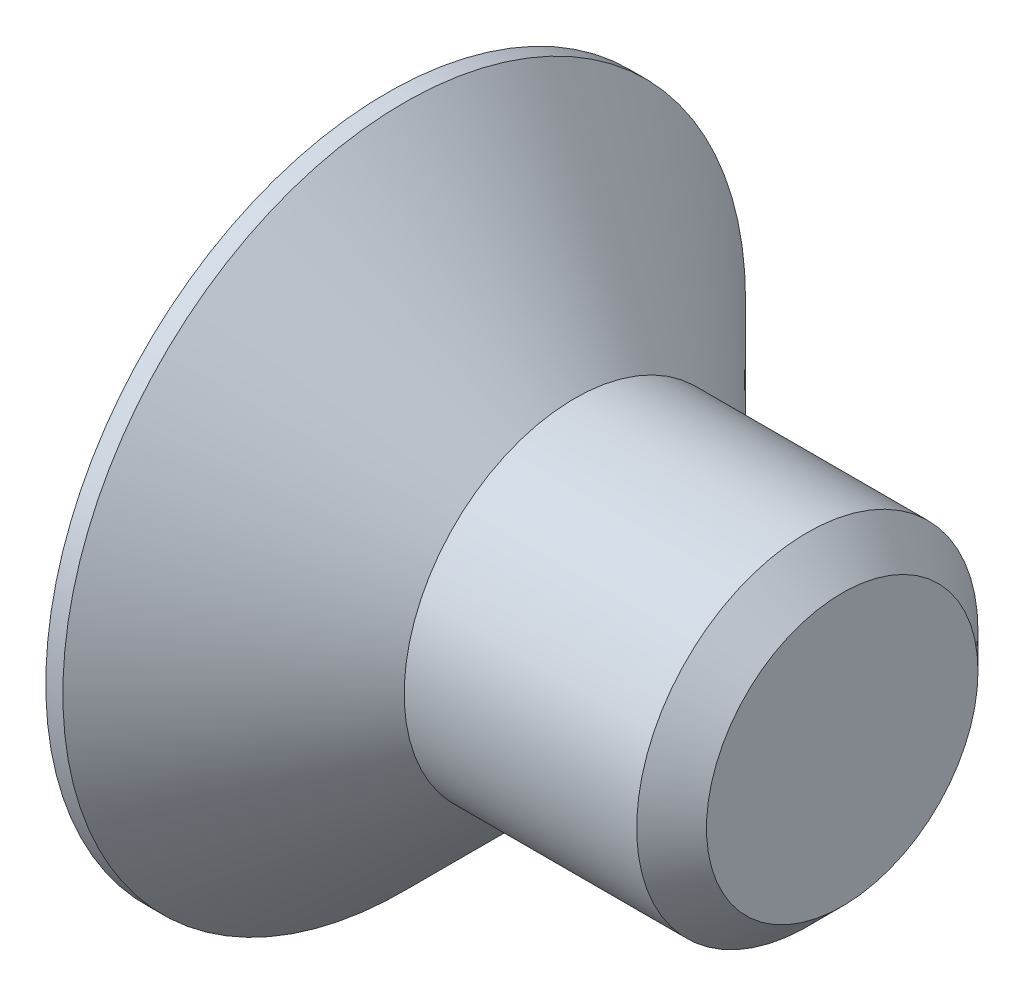
ISO-10303-21;
HEADER;
FILE_DESCRIPTION(('STEP AP214'),'2;1');
FILE_NAME('part.step','',(''),(''),'','','');
FILE_SCHEMA(('AUTOMOTIVE_DESIGN { 1 0 10303 214 1 1 1 1 }'));
ENDSEC;
DATA;
#1=APPLICATION_CONTEXT('core data for automotive mechanical design processes');
#2=APPLICATION_PROTOCOL_DEFINITION('international standard','automotive_design',2000,#1);
#3=PRODUCT_CONTEXT('',#1,'mechanical');
#4=PRODUCT('Part','Part','',(#3));
#5=PRODUCT_RELATED_PRODUCT_CATEGORY('part','',(#4));
#6=PRODUCT_DEFINITION_FORMATION('','',#4);
#7=PRODUCT_DEFINITION_CONTEXT('part definition',#1,'design');
#8=PRODUCT_DEFINITION('design','',#6,#7);
#9=PRODUCT_DEFINITION_SHAPE('','',#8);
#10=(LENGTH_UNIT() NAMED_UNIT(*) SI_UNIT(.MILLI.,.METRE.));
#11=(NAMED_UNIT(*) PLANE_ANGLE_UNIT() SI_UNIT($,.RADIAN.));
#12=(NAMED_UNIT(*) SI_UNIT($,.STERADIAN.) SOLID_ANGLE_UNIT());
#13=UNCERTAINTY_MEASURE_WITH_UNIT(LENGTH_MEASURE(1.E-05),#10,'distance_accuracy_value','');
#14=(GEOMETRIC_REPRESENTATION_CONTEXT(3) GLOBAL_UNCERTAINTY_ASSIGNED_CONTEXT((#13)) GLOBAL_UNIT_ASSIGNED_CONTEXT((#10,
#11,#12)) REPRESENTATION_CONTEXT('',''));
#15=CARTESIAN_POINT('',(0.,0.,0.));
#16=DIRECTION('',(0.,0.,1.));
#17=DIRECTION('',(1.,0.,0.));
#18=AXIS2_PLACEMENT_3D('',#15,#16,#17);
#19=CARTESIAN_POINT('',(-3.3,0.,0.));
#20=DIRECTION('',(1.,0.,0.));
#21=DIRECTION('',(0.,0.,-1.));
#22=AXIS2_PLACEMENT_3D('',#19,#20,#21);
#23=PLANE('',#22);
#24=CARTESIAN_POINT('',(-3.3,0.,0.));
#25=DIRECTION('',(1.,0.,0.));
#26=DIRECTION('',(0.,0.,-1.));
#27=AXIS2_PLACEMENT_3D('',#24,#25,#26);
#28=CIRCLE('',#27,6.);
#29=CARTESIAN_POINT('',(-3.3,0.,-6.));
#30=VERTEX_POINT('',#29);
#31=EDGE_CURVE('E115',#30,#30,#28,.T.);
#32=ORIENTED_EDGE('',*,*,#31,.F.);
#33=EDGE_LOOP('',(#32));
#34=FACE_BOUND('',#33,.T.);
#35=DIRECTION('',(0.,0.499999999999983,-0.866025403784448));
#36=VECTOR('',#35,1.);
#37=CARTESIAN_POINT('',(-3.3,-2.3094010767585,0.));
#38=LINE('',#37,#36);
#39=CARTESIAN_POINT('',(-3.3,-2.3094010767585,0.));
#40=VERTEX_POINT('',#39);
#41=CARTESIAN_POINT('',(-3.3,-1.1547005383793,-2.));
#42=VERTEX_POINT('',#41);
#43=EDGE_CURVE('E100',#40,#42,#38,.T.);
#44=ORIENTED_EDGE('',*,*,#43,.T.);
#45=DIRECTION('',(0.,1.,0.));
#46=VECTOR('',#45,1.);
#47=CARTESIAN_POINT('',(-3.3,-1.1547005383793,-2.));
#48=LINE('',#47,#46);
#49=CARTESIAN_POINT('',(-3.3,1.1547005383793,-2.));
#50=VERTEX_POINT('',#49);
#51=EDGE_CURVE('E88',#42,#50,#48,.T.);
#52=ORIENTED_EDGE('',*,*,#51,.T.);
#53=DIRECTION('',(0.,0.499999999999983,0.866025403784448));
#54=VECTOR('',#53,1.);
#55=CARTESIAN_POINT('',(-3.3,1.1547005383793,-2.));
#56=LINE('',#55,#54);
#57=CARTESIAN_POINT('',(-3.3,2.3094010767585,0.));
#58=VERTEX_POINT('',#57);
#59=EDGE_CURVE('E99',#50,#58,#56,.T.);
#60=ORIENTED_EDGE('',*,*,#59,.T.);
#61=DIRECTION('',(0.,-0.499999999999983,0.866025403784448));
#62=VECTOR('',#61,1.);
#63=CARTESIAN_POINT('',(-3.3,2.3094010767585,0.));
#64=LINE('',#63,#62);
#65=CARTESIAN_POINT('',(-3.3,1.1547005383793,2.));
#66=VERTEX_POINT('',#65);
#67=EDGE_CURVE('E125',#58,#66,#64,.T.);
#68=ORIENTED_EDGE('',*,*,#67,.T.);
#69=DIRECTION('',(0.,-1.,0.));
#70=VECTOR('',#69,1.);
#71=CARTESIAN_POINT('',(-3.3,1.1547005383793,2.));
#72=LINE('',#71,#70);
#73=CARTESIAN_POINT('',(-3.3,-1.1547005383793,2.));
#74=VERTEX_POINT('',#73);
#75=EDGE_CURVE('E130',#66,#74,#72,.T.);
#76=ORIENTED_EDGE('',*,*,#75,.T.);
#77=DIRECTION('',(0.,-0.499999999999983,-0.866025403784448));
#78=VECTOR('',#77,1.);
#79=CARTESIAN_POINT('',(-3.3,-1.1547005383793,2.));
#80=LINE('',#79,#78);
#81=EDGE_CURVE('E114',#74,#40,#80,.T.);
#82=ORIENTED_EDGE('',*,*,#81,.T.);
#83=EDGE_LOOP('',(#44,#52,#60,#68,#76,#82));
#84=FACE_BOUND('',#83,.T.);
#85=ADVANCED_FACE('F16',(#34,#84),#23,.F.);
#86=CARTESIAN_POINT('',(4.7,0.,0.));
#87=DIRECTION('',(1.,0.,0.));
#88=DIRECTION('',(0.,0.,-1.));
#89=AXIS2_PLACEMENT_3D('',#86,#87,#88);
#90=CYLINDRICAL_SURFACE('',#89,6.);
#91=CARTESIAN_POINT('',(-3.,0.,0.));
#92=DIRECTION('',(1.,0.,0.));
#93=DIRECTION('',(0.,0.,-1.));
#94=AXIS2_PLACEMENT_3D('',#91,#92,#93);
#95=CIRCLE('',#94,6.);
#96=CARTESIAN_POINT('',(-3.,0.,-6.));
#97=VERTEX_POINT('',#96);
#98=EDGE_CURVE('E137',#97,#97,#95,.T.);
#99=ORIENTED_EDGE('',*,*,#98,.F.);
#100=EDGE_LOOP('',(#99));
#101=FACE_BOUND('',#100,.T.);
#102=ORIENTED_EDGE('',*,*,#31,.T.);
#103=EDGE_LOOP('',(#102));
#104=FACE_BOUND('',#103,.T.);
#105=ADVANCED_FACE('F270',(#101,#104),#90,.T.);
#106=CARTESIAN_POINT('',(-1.65,-2.3094010767585,0.));
#107=DIRECTION('',(0.,0.866025403784448,0.499999999999983));
#108=DIRECTION('',(0.,-0.499999999999983,0.866025403784448));
#109=AXIS2_PLACEMENT_3D('',#106,#107,#108);
#110=PLANE('',#109);
#111=ORIENTED_EDGE('',*,*,#43,.F.);
#112=DIRECTION('',(-1.,0.,0.));
#113=VECTOR('',#112,1.);
#114=CARTESIAN_POINT('',(-1.65,-2.3094010767585,0.));
#115=LINE('',#114,#113);
#116=CARTESIAN_POINT('',(-1.65,-2.3094010767585,0.));
#117=VERTEX_POINT('',#116);
#118=EDGE_CURVE('E142',#117,#40,#115,.T.);
#119=ORIENTED_EDGE('',*,*,#118,.F.);
#120=DIRECTION('',(0.,0.499999999999983,-0.866025403784448));
#121=VECTOR('',#120,1.);
#122=CARTESIAN_POINT('',(-1.65,-2.3094010767585,0.));
#123=LINE('',#122,#121);
#124=CARTESIAN_POINT('',(-1.65,-1.73205080756889,-0.999999999999966));
#125=VERTEX_POINT('',#124);
#126=EDGE_CURVE('E144',#117,#125,#123,.T.);
#127=ORIENTED_EDGE('',*,*,#126,.T.);
#128=DIRECTION('',(0.,0.499999999999983,-0.866025403784448));
#129=VECTOR('',#128,1.);
#130=CARTESIAN_POINT('',(-1.65,-1.73205080756891,-0.999999999999977));
#131=LINE('',#130,#129);
#132=CARTESIAN_POINT('',(-1.65,-1.1547005383793,-2.));
#133=VERTEX_POINT('',#132);
#134=EDGE_CURVE('E109',#125,#133,#131,.T.);
#135=ORIENTED_EDGE('',*,*,#134,.T.);
#136=DIRECTION('',(-1.,0.,0.));
#137=VECTOR('',#136,1.);
#138=CARTESIAN_POINT('',(-1.65,-1.1547005383793,-2.));
#139=LINE('',#138,#137);
#140=EDGE_CURVE('E92',#133,#42,#139,.T.);
#141=ORIENTED_EDGE('',*,*,#140,.T.);
#142=EDGE_LOOP('',(#111,#119,#127,#135,#141));
#143=FACE_BOUND('',#142,.T.);
#144=ADVANCED_FACE('F105',(#143),#110,.T.);
#145=CARTESIAN_POINT('',(-1.65,-1.1547005383793,-2.));
#146=DIRECTION('',(0.,0.,1.));
#147=DIRECTION('',(1.,0.,0.));
#148=AXIS2_PLACEMENT_3D('',#145,#146,#147);
#149=PLANE('',#148);
#150=ORIENTED_EDGE('',*,*,#51,.F.);
#151=ORIENTED_EDGE('',*,*,#140,.F.);
#152=DIRECTION('',(0.,1.,0.));
#153=VECTOR('',#152,1.);
#154=CARTESIAN_POINT('',(-1.65,-1.1547005383793,-2.));
#155=LINE('',#154,#153);
#156=CARTESIAN_POINT('',(-1.65,0.,-2.));
#157=VERTEX_POINT('',#156);
#158=EDGE_CURVE('E110',#133,#157,#155,.T.);
#159=ORIENTED_EDGE('',*,*,#158,.T.);
#160=DIRECTION('',(0.,1.,0.));
#161=VECTOR('',#160,1.);
#162=CARTESIAN_POINT('',(-1.65,0.,-2.));
#163=LINE('',#162,#161);
#164=CARTESIAN_POINT('',(-1.65,1.1547005383793,-2.));
#165=VERTEX_POINT('',#164);
#166=EDGE_CURVE('E156',#157,#165,#163,.T.);
#167=ORIENTED_EDGE('',*,*,#166,.T.);
#168=DIRECTION('',(-1.,0.,0.));
#169=VECTOR('',#168,1.);
#170=CARTESIAN_POINT('',(-1.65,1.1547005383793,-2.));
#171=LINE('',#170,#169);
#172=EDGE_CURVE('E95',#165,#50,#171,.T.);
#173=ORIENTED_EDGE('',*,*,#172,.T.);
#174=EDGE_LOOP('',(#150,#151,#159,#167,#173));
#175=FACE_BOUND('',#174,.T.);
#176=ADVANCED_FACE('F90',(#175),#149,.T.);
#177=CARTESIAN_POINT('',(-1.65,1.1547005383793,-2.));
#178=DIRECTION('',(0.,-0.866025403784448,0.499999999999983));
#179=DIRECTION('',(0.,-0.499999999999983,-0.866025403784448));
#180=AXIS2_PLACEMENT_3D('',#177,#178,#179);
#181=PLANE('',#180);
#182=ORIENTED_EDGE('',*,*,#59,.F.);
#183=ORIENTED_EDGE('',*,*,#172,.F.);
#184=DIRECTION('',(0.,0.499999999999983,0.866025403784448));
#185=VECTOR('',#184,1.);
#186=CARTESIAN_POINT('',(-1.65,1.1547005383793,-2.));
#187=LINE('',#186,#185);
#188=CARTESIAN_POINT('',(-1.65,1.73205080756891,-0.999999999999976));
#189=VERTEX_POINT('',#188);
#190=EDGE_CURVE('E163',#165,#189,#187,.T.);
#191=ORIENTED_EDGE('',*,*,#190,.T.);
#192=DIRECTION('',(0.,0.499999999999983,0.866025403784448));
#193=VECTOR('',#192,1.);
#194=CARTESIAN_POINT('',(-1.65,1.73205080756891,-0.999999999999975));
#195=LINE('',#194,#193);
#196=CARTESIAN_POINT('',(-1.65,2.3094010767585,0.));
#197=VERTEX_POINT('',#196);
#198=EDGE_CURVE('E168',#189,#197,#195,.T.);
#199=ORIENTED_EDGE('',*,*,#198,.T.);
#200=DIRECTION('',(-1.,0.,0.));
#201=VECTOR('',#200,1.);
#202=CARTESIAN_POINT('',(-1.65,2.3094010767585,0.));
#203=LINE('',#202,#201);
#204=EDGE_CURVE('E173',#197,#58,#203,.T.);
#205=ORIENTED_EDGE('',*,*,#204,.T.);
#206=EDGE_LOOP('',(#182,#183,#191,#199,#205));
#207=FACE_BOUND('',#206,.T.);
#208=ADVANCED_FACE('F286',(#207),#181,.T.);
#209=CARTESIAN_POINT('',(-1.65,2.3094010767585,0.));
#210=DIRECTION('',(0.,-0.866025403784448,-0.499999999999983));
#211=DIRECTION('',(0.,0.499999999999983,-0.866025403784448));
#212=AXIS2_PLACEMENT_3D('',#209,#210,#211);
#213=PLANE('',#212);
#214=ORIENTED_EDGE('',*,*,#67,.F.);
#215=ORIENTED_EDGE('',*,*,#204,.F.);
#216=DIRECTION('',(0.,-0.499999999999983,0.866025403784448));
#217=VECTOR('',#216,1.);
#218=CARTESIAN_POINT('',(-1.65,2.3094010767585,0.));
#219=LINE('',#218,#217);
#220=CARTESIAN_POINT('',(-1.65,1.73205080756891,0.999999999999976));
#221=VERTEX_POINT('',#220);
#222=EDGE_CURVE('E178',#197,#221,#219,.T.);
#223=ORIENTED_EDGE('',*,*,#222,.T.);
#224=DIRECTION('',(0.,-0.499999999999983,0.866025403784448));
#225=VECTOR('',#224,1.);
#226=CARTESIAN_POINT('',(-1.65,1.73205080756891,0.999999999999976));
#227=LINE('',#226,#225);
#228=CARTESIAN_POINT('',(-1.65,1.1547005383793,2.));
#229=VERTEX_POINT('',#228);
#230=EDGE_CURVE('E183',#221,#229,#227,.T.);
#231=ORIENTED_EDGE('',*,*,#230,.T.);
#232=DIRECTION('',(-1.,0.,0.));
#233=VECTOR('',#232,1.);
#234=CARTESIAN_POINT('',(-1.65,1.1547005383793,2.));
#235=LINE('',#234,#233);
#236=EDGE_CURVE('E188',#229,#66,#235,.T.);
#237=ORIENTED_EDGE('',*,*,#236,.T.);
#238=EDGE_LOOP('',(#214,#215,#223,#231,#237));
#239=FACE_BOUND('',#238,.T.);
#240=ADVANCED_FACE('F289',(#239),#213,.T.);
#241=CARTESIAN_POINT('',(-1.65,1.1547005383793,2.));
#242=DIRECTION('',(0.,0.,-1.));
#243=DIRECTION('',(-1.,0.,0.));
#244=AXIS2_PLACEMENT_3D('',#241,#242,#243);
#245=PLANE('',#244);
#246=ORIENTED_EDGE('',*,*,#75,.F.);
#247=ORIENTED_EDGE('',*,*,#236,.F.);
#248=DIRECTION('',(0.,-1.,0.));
#249=VECTOR('',#248,1.);
#250=CARTESIAN_POINT('',(-1.65,1.1547005383793,2.));
#251=LINE('',#250,#249);
#252=CARTESIAN_POINT('',(-1.65,0.,2.));
#253=VERTEX_POINT('',#252);
#254=EDGE_CURVE('E193',#229,#253,#251,.T.);
#255=ORIENTED_EDGE('',*,*,#254,.T.);
#256=DIRECTION('',(0.,-1.,0.));
#257=VECTOR('',#256,1.);
#258=CARTESIAN_POINT('',(-1.65,0.,2.));
#259=LINE('',#258,#257);
#260=CARTESIAN_POINT('',(-1.65,-1.1547005383793,2.));
#261=VERTEX_POINT('',#260);
#262=EDGE_CURVE('E198',#253,#261,#259,.T.);
#263=ORIENTED_EDGE('',*,*,#262,.T.);
#264=DIRECTION('',(-1.,0.,0.));
#265=VECTOR('',#264,1.);
#266=CARTESIAN_POINT('',(-1.65,-1.1547005383793,2.));
#267=LINE('',#266,#265);
#268=EDGE_CURVE('E203',#261,#74,#267,.T.);
#269=ORIENTED_EDGE('',*,*,#268,.T.);
#270=EDGE_LOOP('',(#246,#247,#255,#263,#269));
#271=FACE_BOUND('',#270,.T.);
#272=ADVANCED_FACE('F293',(#271),#245,.T.);
#273=CARTESIAN_POINT('',(-1.65,-1.1547005383793,2.));
#274=DIRECTION('',(0.,0.866025403784448,-0.499999999999983));
#275=DIRECTION('',(0.,0.499999999999983,0.866025403784448));
#276=AXIS2_PLACEMENT_3D('',#273,#274,#275);
#277=PLANE('',#276);
#278=ORIENTED_EDGE('',*,*,#81,.F.);
#279=ORIENTED_EDGE('',*,*,#268,.F.);
#280=DIRECTION('',(0.,-0.499999999999983,-0.866025403784448));
#281=VECTOR('',#280,1.);
#282=CARTESIAN_POINT('',(-1.65,-1.1547005383793,2.));
#283=LINE('',#282,#281);
#284=CARTESIAN_POINT('',(-1.65,-1.73205080756891,0.999999999999976));
#285=VERTEX_POINT('',#284);
#286=EDGE_CURVE('E208',#261,#285,#283,.T.);
#287=ORIENTED_EDGE('',*,*,#286,.T.);
#288=DIRECTION('',(0.,-0.499999999999983,-0.866025403784448));
#289=VECTOR('',#288,1.);
#290=CARTESIAN_POINT('',(-1.65,-1.73205080756891,0.999999999999975));
#291=LINE('',#290,#289);
#292=EDGE_CURVE('E213',#285,#117,#291,.T.);
#293=ORIENTED_EDGE('',*,*,#292,.T.);
#294=ORIENTED_EDGE('',*,*,#118,.T.);
#295=EDGE_LOOP('',(#278,#279,#287,#293,#294));
#296=FACE_BOUND('',#295,.T.);
#297=ADVANCED_FACE('F266',(#296),#277,.T.);
#298=CARTESIAN_POINT('',(-3.,0.,0.));
#299=DIRECTION('',(-1.,0.,0.));
#300=DIRECTION('',(0.,0.,1.));
#301=AXIS2_PLACEMENT_3D('',#298,#299,#300);
#302=CONICAL_SURFACE('',#301,6.,0.785398163397448);
#303=CARTESIAN_POINT('',(0.,0.,0.));
#304=DIRECTION('',(1.,0.,0.));
#305=DIRECTION('',(0.,0.,-1.));
#306=AXIS2_PLACEMENT_3D('',#303,#304,#305);
#307=CIRCLE('',#306,3.);
#308=CARTESIAN_POINT('',(0.,0.,-3.));
#309=VERTEX_POINT('',#308);
#310=EDGE_CURVE('E218',#309,#309,#307,.T.);
#311=ORIENTED_EDGE('',*,*,#310,.F.);
#312=EDGE_LOOP('',(#311));
#313=FACE_BOUND('',#312,.T.);
#314=ORIENTED_EDGE('',*,*,#98,.T.);
#315=EDGE_LOOP('',(#314));
#316=FACE_BOUND('',#315,.T.);
#317=ADVANCED_FACE('F262',(#313,#316),#302,.T.);
#318=CARTESIAN_POINT('',(-1.65,0.,0.));
#319=DIRECTION('',(1.,0.,0.));
#320=DIRECTION('',(0.,0.,-1.));
#321=AXIS2_PLACEMENT_3D('',#318,#319,#320);
#322=PLANE('',#321);
#323=CARTESIAN_POINT('',(-1.65,0.,0.));
#324=DIRECTION('',(1.,0.,0.));
#325=DIRECTION('',(0.,-0.866025403784449,0.499999999999983));
#326=AXIS2_PLACEMENT_3D('',#323,#324,#325);
#327=CIRCLE('',#326,2.);
#328=EDGE_CURVE('E34',#285,#125,#327,.T.);
#329=ORIENTED_EDGE('',*,*,#328,.T.);
#330=ORIENTED_EDGE('',*,*,#126,.F.);
#331=ORIENTED_EDGE('',*,*,#292,.F.);
#332=EDGE_LOOP('',(#329,#330,#331));
#333=FACE_BOUND('',#332,.T.);
#334=ADVANCED_FACE('F265',(#333),#322,.F.);
#335=CARTESIAN_POINT('',(-1.65,0.,0.));
#336=DIRECTION('',(1.,0.,0.));
#337=DIRECTION('',(0.,-0.866025403784448,-0.499999999999983));
#338=AXIS2_PLACEMENT_3D('',#335,#336,#337);
#339=CIRCLE('',#338,2.);
#340=EDGE_CURVE('E224',#125,#157,#339,.T.);
#341=ORIENTED_EDGE('',*,*,#340,.T.);
#342=ORIENTED_EDGE('',*,*,#158,.F.);
#343=ORIENTED_EDGE('',*,*,#134,.F.);
#344=EDGE_LOOP('',(#341,#342,#343));
#345=FACE_BOUND('',#344,.T.);
#346=ADVANCED_FACE('F302',(#345),#322,.F.);
#347=CARTESIAN_POINT('',(-1.65,0.,0.));
#348=DIRECTION('',(1.,0.,0.));
#349=DIRECTION('',(0.,0.,-1.));
#350=AXIS2_PLACEMENT_3D('',#347,#348,#349);
#351=CIRCLE('',#350,2.);
#352=EDGE_CURVE('E229',#157,#189,#351,.T.);
#353=ORIENTED_EDGE('',*,*,#352,.T.);
#354=ORIENTED_EDGE('',*,*,#190,.F.);
#355=ORIENTED_EDGE('',*,*,#166,.F.);
#356=EDGE_LOOP('',(#353,#354,#355));
#357=FACE_BOUND('',#356,.T.);
#358=ADVANCED_FACE('F364',(#357),#322,.F.);
#359=CARTESIAN_POINT('',(-1.65,0.,0.));
#360=DIRECTION('',(1.,0.,0.));
#361=DIRECTION('',(0.,0.866025403784448,-0.499999999999983));
#362=AXIS2_PLACEMENT_3D('',#359,#360,#361);
#363=CIRCLE('',#362,2.);
#364=EDGE_CURVE('E234',#189,#221,#363,.T.);
#365=ORIENTED_EDGE('',*,*,#364,.T.);
#366=ORIENTED_EDGE('',*,*,#222,.F.);
#367=ORIENTED_EDGE('',*,*,#198,.F.);
#368=EDGE_LOOP('',(#365,#366,#367));
#369=FACE_BOUND('',#368,.T.);
#370=ADVANCED_FACE('F355',(#369),#322,.F.);
#371=CARTESIAN_POINT('',(-1.65,0.,0.));
#372=DIRECTION('',(1.,0.,0.));
#373=DIRECTION('',(0.,0.866025403784449,0.499999999999983));
#374=AXIS2_PLACEMENT_3D('',#371,#372,#373);
#375=CIRCLE('',#374,2.);
#376=EDGE_CURVE('E239',#221,#253,#375,.T.);
#377=ORIENTED_EDGE('',*,*,#376,.T.);
#378=ORIENTED_EDGE('',*,*,#254,.F.);
#379=ORIENTED_EDGE('',*,*,#230,.F.);
#380=EDGE_LOOP('',(#377,#378,#379));
#381=FACE_BOUND('',#380,.T.);
#382=ADVANCED_FACE('F346',(#381),#322,.F.);
#383=CARTESIAN_POINT('',(-1.65,0.,0.));
#384=DIRECTION('',(1.,0.,0.));
#385=DIRECTION('',(0.,0.,1.));
#386=AXIS2_PLACEMENT_3D('',#383,#384,#385);
#387=CIRCLE('',#386,2.);
#388=EDGE_CURVE('E244',#253,#285,#387,.T.);
#389=ORIENTED_EDGE('',*,*,#388,.T.);
#390=ORIENTED_EDGE('',*,*,#286,.F.);
#391=ORIENTED_EDGE('',*,*,#262,.F.);
#392=EDGE_LOOP('',(#389,#390,#391));
#393=FACE_BOUND('',#392,.T.);
#394=ADVANCED_FACE('F258',(#393),#322,.F.);
#395=CARTESIAN_POINT('',(4.7,0.,0.));
#396=DIRECTION('',(1.,0.,0.));
#397=DIRECTION('',(0.,0.,-1.));
#398=AXIS2_PLACEMENT_3D('',#395,#396,#397);
#399=CYLINDRICAL_SURFACE('',#398,3.);
#400=CARTESIAN_POINT('',(4.0865,0.,0.));
#401=DIRECTION('',(1.,0.,0.));
#402=DIRECTION('',(0.,0.,-1.));
#403=AXIS2_PLACEMENT_3D('',#400,#401,#402);
#404=CIRCLE('',#403,3.);
#405=CARTESIAN_POINT('',(4.0865,0.,-3.));
#406=VERTEX_POINT('',#405);
#407=EDGE_CURVE('E24',#406,#406,#404,.T.);
#408=ORIENTED_EDGE('',*,*,#407,.F.);
#409=EDGE_LOOP('',(#408));
#410=FACE_BOUND('',#409,.T.);
#411=ORIENTED_EDGE('',*,*,#310,.T.);
#412=EDGE_LOOP('',(#411));
#413=FACE_BOUND('',#412,.T.);
#414=ADVANCED_FACE('F254',(#410,#413),#399,.T.);
#415=CARTESIAN_POINT('',(-1.65,0.,0.));
#416=DIRECTION('',(-1.,0.,0.));
#417=DIRECTION('',(0.,0.,1.));
#418=AXIS2_PLACEMENT_3D('',#415,#416,#417);
#419=CONICAL_SURFACE('',#418,2.,1.30899693899577);
#420=CARTESIAN_POINT('',(-1.1141016151378,0.,0.));
#421=VERTEX_POINT('',#420);
#422=VERTEX_LOOP('',#421);
#423=FACE_BOUND('',#422,.T.);
#424=ORIENTED_EDGE('',*,*,#352,.F.);
#425=ORIENTED_EDGE('',*,*,#340,.F.);
#426=ORIENTED_EDGE('',*,*,#328,.F.);
#427=ORIENTED_EDGE('',*,*,#388,.F.);
#428=ORIENTED_EDGE('',*,*,#376,.F.);
#429=ORIENTED_EDGE('',*,*,#364,.F.);
#430=EDGE_LOOP('',(#424,#425,#426,#427,#428,#429));
#431=FACE_BOUND('',#430,.T.);
#432=ADVANCED_FACE('F257',(#423,#431),#419,.F.);
#433=CARTESIAN_POINT('',(4.0865,0.,0.));
#434=DIRECTION('',(-1.,0.,0.));
#435=DIRECTION('',(0.,0.,1.));
#436=AXIS2_PLACEMENT_3D('',#433,#434,#435);
#437=CONICAL_SURFACE('',#436,3.,0.785398163397448);
#438=CARTESIAN_POINT('',(4.7,0.,0.));
#439=DIRECTION('',(1.,0.,0.));
#440=DIRECTION('',(0.,0.,-1.));
#441=AXIS2_PLACEMENT_3D('',#438,#439,#440);
#442=CIRCLE('',#441,2.3865);
#443=CARTESIAN_POINT('',(4.7,0.,-2.3865));
#444=VERTEX_POINT('',#443);
#445=EDGE_CURVE('E11',#444,#444,#442,.T.);
#446=ORIENTED_EDGE('',*,*,#445,.F.);
#447=EDGE_LOOP('',(#446));
#448=FACE_BOUND('',#447,.T.);
#449=ORIENTED_EDGE('',*,*,#407,.T.);
#450=EDGE_LOOP('',(#449));
#451=FACE_BOUND('',#450,.T.);
#452=ADVANCED_FACE('F252',(#448,#451),#437,.T.);
#453=CARTESIAN_POINT('',(4.7,2.3865,0.));
#454=DIRECTION('',(-1.,0.,0.));
#455=DIRECTION('',(0.,0.,1.));
#456=AXIS2_PLACEMENT_3D('',#453,#454,#455);
#457=PLANE('',#456);
#458=ORIENTED_EDGE('',*,*,#445,.T.);
#459=EDGE_LOOP('',(#458));
#460=FACE_BOUND('',#459,.T.);
#461=ADVANCED_FACE('F18',(#460),#457,.F.);
#462=CLOSED_SHELL('',(#85,#105,#144,#176,#208,#240,#272,#297,#317,#334,#346,#358,#370,#382,#394,
#414,#432,#452,#461));
#463=MANIFOLD_SOLID_BREP('B1',#462);
#464=ADVANCED_BREP_SHAPE_REPRESENTATION('',(#18,#463),#14);
#465=SHAPE_DEFINITION_REPRESENTATION(#9,#464);
ENDSEC;
END-ISO-10303-21;
